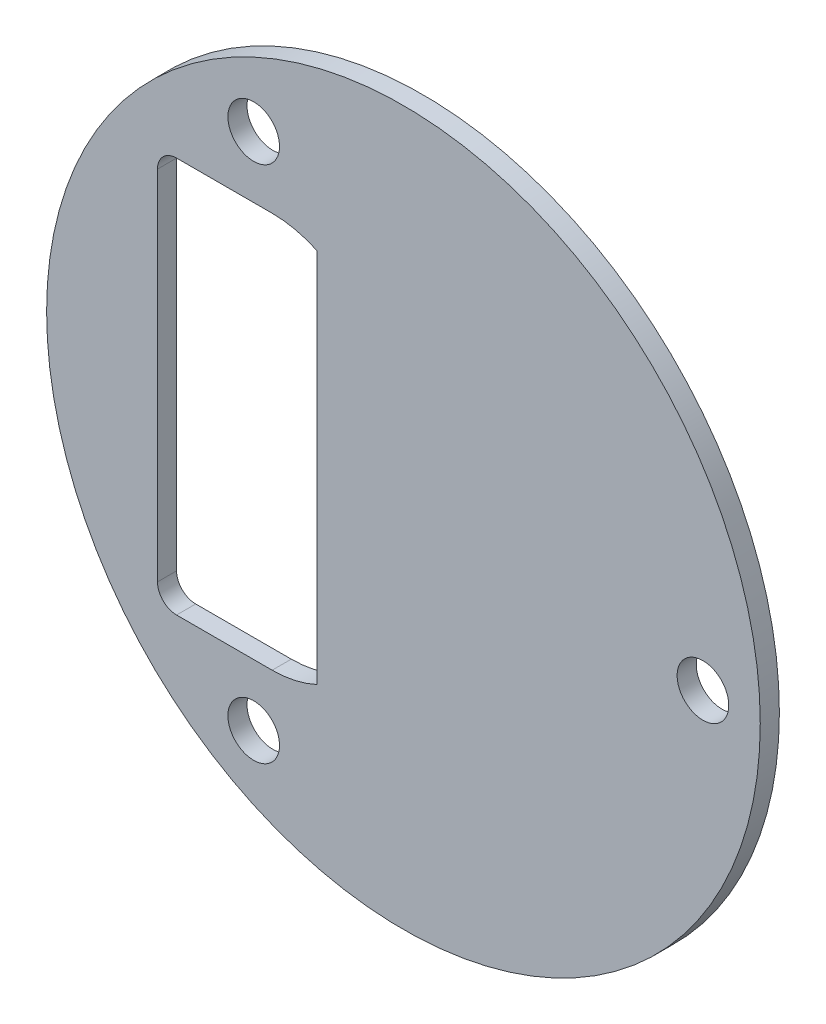
ISO-10303-21;
HEADER;
FILE_DESCRIPTION(('STEP AP214'),'2;1');
FILE_NAME('part.step','',(''),(''),'','','');
FILE_SCHEMA(('AUTOMOTIVE_DESIGN { 1 0 10303 214 1 1 1 1 }'));
ENDSEC;
DATA;
#1=APPLICATION_CONTEXT('core data for automotive mechanical design processes');
#2=APPLICATION_PROTOCOL_DEFINITION('international standard','automotive_design',2000,#1);
#3=PRODUCT_CONTEXT('',#1,'mechanical');
#4=PRODUCT('Part','Part','',(#3));
#5=PRODUCT_RELATED_PRODUCT_CATEGORY('part','',(#4));
#6=PRODUCT_DEFINITION_FORMATION('','',#4);
#7=PRODUCT_DEFINITION_CONTEXT('part definition',#1,'design');
#8=PRODUCT_DEFINITION('design','',#6,#7);
#9=PRODUCT_DEFINITION_SHAPE('','',#8);
#10=(LENGTH_UNIT() NAMED_UNIT(*) SI_UNIT(.MILLI.,.METRE.));
#11=(NAMED_UNIT(*) PLANE_ANGLE_UNIT() SI_UNIT($,.RADIAN.));
#12=(NAMED_UNIT(*) SI_UNIT($,.STERADIAN.) SOLID_ANGLE_UNIT());
#13=UNCERTAINTY_MEASURE_WITH_UNIT(LENGTH_MEASURE(1.E-05),#10,'distance_accuracy_value','');
#14=(GEOMETRIC_REPRESENTATION_CONTEXT(3) GLOBAL_UNCERTAINTY_ASSIGNED_CONTEXT((#13)) GLOBAL_UNIT_ASSIGNED_CONTEXT((#10,
#11,#12)) REPRESENTATION_CONTEXT('',''));
#15=CARTESIAN_POINT('',(0.,0.,0.));
#16=DIRECTION('',(0.,0.,1.));
#17=DIRECTION('',(1.,0.,0.));
#18=AXIS2_PLACEMENT_3D('',#15,#16,#17);
#19=CARTESIAN_POINT('',(0.,31.05,3.));
#20=DIRECTION('',(0.,-1.,0.));
#21=DIRECTION('',(1.,0.,0.));
#22=AXIS2_PLACEMENT_3D('',#19,#20,#21);
#23=PLANE('',#22);
#24=DIRECTION('',(-1.,0.,0.));
#25=VECTOR('',#24,1.);
#26=CARTESIAN_POINT('',(0.,31.05,0.));
#27=LINE('',#26,#25);
#28=CARTESIAN_POINT('',(-20.6036211039443,31.05,0.));
#29=VERTEX_POINT('',#28);
#30=CARTESIAN_POINT('',(-35.6036211039443,31.05,0.));
#31=VERTEX_POINT('',#30);
#32=EDGE_CURVE('E176',#29,#31,#27,.T.);
#33=ORIENTED_EDGE('',*,*,#32,.F.);
#34=DIRECTION('',(0.,0.,-1.));
#35=VECTOR('',#34,1.);
#36=CARTESIAN_POINT('',(-20.6036211039443,31.05,3.));
#37=LINE('',#36,#35);
#38=CARTESIAN_POINT('',(-20.6036211039443,31.05,3.));
#39=VERTEX_POINT('',#38);
#40=EDGE_CURVE('E11',#39,#29,#37,.T.);
#41=ORIENTED_EDGE('',*,*,#40,.F.);
#42=DIRECTION('',(-1.,0.,0.));
#43=VECTOR('',#42,1.);
#44=CARTESIAN_POINT('',(0.,31.05,3.));
#45=LINE('',#44,#43);
#46=CARTESIAN_POINT('',(-35.6036211039443,31.05,3.));
#47=VERTEX_POINT('',#46);
#48=EDGE_CURVE('E389',#39,#47,#45,.T.);
#49=ORIENTED_EDGE('',*,*,#48,.T.);
#50=DIRECTION('',(0.,0.,-1.));
#51=VECTOR('',#50,1.);
#52=CARTESIAN_POINT('',(-35.6036211039443,31.05,3.));
#53=LINE('',#52,#51);
#54=EDGE_CURVE('E66',#47,#31,#53,.T.);
#55=ORIENTED_EDGE('',*,*,#54,.T.);
#56=EDGE_LOOP('',(#33,#41,#49,#55));
#57=FACE_BOUND('',#56,.T.);
#58=ADVANCED_FACE('F45',(#57),#23,.T.);
#59=CARTESIAN_POINT('',(-20.6036211039443,14.4685483870968,3.));
#60=DIRECTION('',(0.,0.,-1.));
#61=DIRECTION('',(-1.,0.,0.));
#62=AXIS2_PLACEMENT_3D('',#59,#60,#61);
#63=CYLINDRICAL_SURFACE('',#62,16.5814516129032);
#64=CARTESIAN_POINT('',(-20.6036211039443,14.4685483870968,0.));
#65=DIRECTION('',(0.,0.,1.));
#66=DIRECTION('',(1.,0.,0.));
#67=AXIS2_PLACEMENT_3D('',#64,#65,#66);
#68=CIRCLE('',#67,16.5814516129032);
#69=CARTESIAN_POINT('',(-13.6036211039443,29.5,0.));
#70=VERTEX_POINT('',#69);
#71=EDGE_CURVE('E179',#29,#70,#68,.F.);
#72=ORIENTED_EDGE('',*,*,#71,.T.);
#73=DIRECTION('',(0.,0.,-1.));
#74=VECTOR('',#73,1.);
#75=CARTESIAN_POINT('',(-13.6036211039443,29.5,3.));
#76=LINE('',#75,#74);
#77=CARTESIAN_POINT('',(-13.6036211039443,29.5,3.));
#78=VERTEX_POINT('',#77);
#79=EDGE_CURVE('E55',#78,#70,#76,.T.);
#80=ORIENTED_EDGE('',*,*,#79,.F.);
#81=CARTESIAN_POINT('',(-20.6036211039443,14.4685483870968,3.));
#82=DIRECTION('',(0.,0.,1.));
#83=DIRECTION('',(1.,0.,0.));
#84=AXIS2_PLACEMENT_3D('',#81,#82,#83);
#85=CIRCLE('',#84,16.5814516129032);
#86=EDGE_CURVE('E386',#39,#78,#85,.F.);
#87=ORIENTED_EDGE('',*,*,#86,.F.);
#88=ORIENTED_EDGE('',*,*,#40,.T.);
#89=EDGE_LOOP('',(#72,#80,#87,#88));
#90=FACE_BOUND('',#89,.T.);
#91=ADVANCED_FACE('F227',(#90),#63,.F.);
#92=CARTESIAN_POINT('',(-13.6036211039443,0.,3.));
#93=DIRECTION('',(1.,0.,0.));
#94=DIRECTION('',(0.,0.,-1.));
#95=AXIS2_PLACEMENT_3D('',#92,#93,#94);
#96=PLANE('',#95);
#97=DIRECTION('',(0.,-1.,0.));
#98=VECTOR('',#97,1.);
#99=CARTESIAN_POINT('',(-13.6036211039443,0.,0.));
#100=LINE('',#99,#98);
#101=CARTESIAN_POINT('',(-13.6036211039443,-29.5,0.));
#102=VERTEX_POINT('',#101);
#103=EDGE_CURVE('E183',#70,#102,#100,.T.);
#104=ORIENTED_EDGE('',*,*,#103,.T.);
#105=DIRECTION('',(0.,0.,-1.));
#106=VECTOR('',#105,1.);
#107=CARTESIAN_POINT('',(-13.6036211039443,-29.5,3.));
#108=LINE('',#107,#106);
#109=CARTESIAN_POINT('',(-13.6036211039443,-29.5,3.));
#110=VERTEX_POINT('',#109);
#111=EDGE_CURVE('E214',#110,#102,#108,.T.);
#112=ORIENTED_EDGE('',*,*,#111,.F.);
#113=DIRECTION('',(0.,-1.,0.));
#114=VECTOR('',#113,1.);
#115=CARTESIAN_POINT('',(-13.6036211039443,0.,3.));
#116=LINE('',#115,#114);
#117=EDGE_CURVE('E223',#78,#110,#116,.T.);
#118=ORIENTED_EDGE('',*,*,#117,.F.);
#119=ORIENTED_EDGE('',*,*,#79,.T.);
#120=EDGE_LOOP('',(#104,#112,#118,#119));
#121=FACE_BOUND('',#120,.T.);
#122=ADVANCED_FACE('F221',(#121),#96,.F.);
#123=CARTESIAN_POINT('',(-20.6036211039443,-14.4685483870968,3.));
#124=DIRECTION('',(0.,0.,-1.));
#125=DIRECTION('',(-1.,0.,0.));
#126=AXIS2_PLACEMENT_3D('',#123,#124,#125);
#127=CYLINDRICAL_SURFACE('',#126,16.5814516129032);
#128=CARTESIAN_POINT('',(-20.6036211039443,-14.4685483870968,0.));
#129=DIRECTION('',(0.,0.,1.));
#130=DIRECTION('',(1.,0.,0.));
#131=AXIS2_PLACEMENT_3D('',#128,#129,#130);
#132=CIRCLE('',#131,16.5814516129032);
#133=CARTESIAN_POINT('',(-20.6036211039443,-31.05,0.));
#134=VERTEX_POINT('',#133);
#135=EDGE_CURVE('E187',#134,#102,#132,.T.);
#136=ORIENTED_EDGE('',*,*,#135,.F.);
#137=DIRECTION('',(0.,0.,-1.));
#138=VECTOR('',#137,1.);
#139=CARTESIAN_POINT('',(-20.6036211039443,-31.05,3.));
#140=LINE('',#139,#138);
#141=CARTESIAN_POINT('',(-20.6036211039443,-31.05,3.));
#142=VERTEX_POINT('',#141);
#143=EDGE_CURVE('E211',#142,#134,#140,.T.);
#144=ORIENTED_EDGE('',*,*,#143,.F.);
#145=CARTESIAN_POINT('',(-20.6036211039443,-14.4685483870968,3.));
#146=DIRECTION('',(0.,0.,1.));
#147=DIRECTION('',(1.,0.,0.));
#148=AXIS2_PLACEMENT_3D('',#145,#146,#147);
#149=CIRCLE('',#148,16.5814516129032);
#150=EDGE_CURVE('E381',#142,#110,#149,.T.);
#151=ORIENTED_EDGE('',*,*,#150,.T.);
#152=ORIENTED_EDGE('',*,*,#111,.T.);
#153=EDGE_LOOP('',(#136,#144,#151,#152));
#154=FACE_BOUND('',#153,.T.);
#155=ADVANCED_FACE('F283',(#154),#127,.F.);
#156=CARTESIAN_POINT('',(0.,-31.05,3.));
#157=DIRECTION('',(0.,1.,0.));
#158=DIRECTION('',(-1.,0.,0.));
#159=AXIS2_PLACEMENT_3D('',#156,#157,#158);
#160=PLANE('',#159);
#161=DIRECTION('',(1.,0.,0.));
#162=VECTOR('',#161,1.);
#163=CARTESIAN_POINT('',(0.,-31.05,0.));
#164=LINE('',#163,#162);
#165=CARTESIAN_POINT('',(-35.6036211039443,-31.05,0.));
#166=VERTEX_POINT('',#165);
#167=EDGE_CURVE('E191',#166,#134,#164,.T.);
#168=ORIENTED_EDGE('',*,*,#167,.F.);
#169=DIRECTION('',(0.,0.,-1.));
#170=VECTOR('',#169,1.);
#171=CARTESIAN_POINT('',(-35.6036211039443,-31.05,3.));
#172=LINE('',#171,#170);
#173=CARTESIAN_POINT('',(-35.6036211039443,-31.05,3.));
#174=VERTEX_POINT('',#173);
#175=EDGE_CURVE('E139',#174,#166,#172,.T.);
#176=ORIENTED_EDGE('',*,*,#175,.F.);
#177=DIRECTION('',(1.,0.,0.));
#178=VECTOR('',#177,1.);
#179=CARTESIAN_POINT('',(0.,-31.05,3.));
#180=LINE('',#179,#178);
#181=EDGE_CURVE('E150',#174,#142,#180,.T.);
#182=ORIENTED_EDGE('',*,*,#181,.T.);
#183=ORIENTED_EDGE('',*,*,#143,.T.);
#184=EDGE_LOOP('',(#168,#176,#182,#183));
#185=FACE_BOUND('',#184,.T.);
#186=ADVANCED_FACE('F280',(#185),#160,.T.);
#187=CARTESIAN_POINT('',(-35.6036211039443,-28.05,3.));
#188=DIRECTION('',(0.,0.,-1.));
#189=DIRECTION('',(-1.,0.,0.));
#190=AXIS2_PLACEMENT_3D('',#187,#188,#189);
#191=CYLINDRICAL_SURFACE('',#190,3.);
#192=CARTESIAN_POINT('',(-35.6036211039443,-28.05,0.));
#193=DIRECTION('',(0.,0.,1.));
#194=DIRECTION('',(1.,0.,0.));
#195=AXIS2_PLACEMENT_3D('',#192,#193,#194);
#196=CIRCLE('',#195,3.);
#197=CARTESIAN_POINT('',(-38.6036211039443,-28.05,0.));
#198=VERTEX_POINT('',#197);
#199=EDGE_CURVE('E134',#198,#166,#196,.T.);
#200=ORIENTED_EDGE('',*,*,#199,.F.);
#201=DIRECTION('',(0.,0.,-1.));
#202=VECTOR('',#201,1.);
#203=CARTESIAN_POINT('',(-38.6036211039443,-28.05,3.));
#204=LINE('',#203,#202);
#205=CARTESIAN_POINT('',(-38.6036211039443,-28.05,3.));
#206=VERTEX_POINT('',#205);
#207=EDGE_CURVE('E129',#206,#198,#204,.T.);
#208=ORIENTED_EDGE('',*,*,#207,.F.);
#209=CARTESIAN_POINT('',(-35.6036211039443,-28.05,3.));
#210=DIRECTION('',(0.,0.,1.));
#211=DIRECTION('',(1.,0.,0.));
#212=AXIS2_PLACEMENT_3D('',#209,#210,#211);
#213=CIRCLE('',#212,3.);
#214=EDGE_CURVE('E132',#206,#174,#213,.T.);
#215=ORIENTED_EDGE('',*,*,#214,.T.);
#216=ORIENTED_EDGE('',*,*,#175,.T.);
#217=EDGE_LOOP('',(#200,#208,#215,#216));
#218=FACE_BOUND('',#217,.T.);
#219=ADVANCED_FACE('F131',(#218),#191,.F.);
#220=CARTESIAN_POINT('',(-38.6036211039443,0.,3.));
#221=DIRECTION('',(1.,0.,0.));
#222=DIRECTION('',(0.,1.,0.));
#223=AXIS2_PLACEMENT_3D('',#220,#221,#222);
#224=PLANE('',#223);
#225=DIRECTION('',(0.,-1.,0.));
#226=VECTOR('',#225,1.);
#227=CARTESIAN_POINT('',(-38.6036211039443,0.,0.));
#228=LINE('',#227,#226);
#229=CARTESIAN_POINT('',(-38.6036211039443,28.05,0.));
#230=VERTEX_POINT('',#229);
#231=EDGE_CURVE('E197',#230,#198,#228,.T.);
#232=ORIENTED_EDGE('',*,*,#231,.F.);
#233=DIRECTION('',(0.,0.,-1.));
#234=VECTOR('',#233,1.);
#235=CARTESIAN_POINT('',(-38.6036211039443,28.05,3.));
#236=LINE('',#235,#234);
#237=CARTESIAN_POINT('',(-38.6036211039443,28.05,3.));
#238=VERTEX_POINT('',#237);
#239=EDGE_CURVE('E100',#238,#230,#236,.T.);
#240=ORIENTED_EDGE('',*,*,#239,.F.);
#241=DIRECTION('',(0.,-1.,0.));
#242=VECTOR('',#241,1.);
#243=CARTESIAN_POINT('',(-38.6036211039443,0.,3.));
#244=LINE('',#243,#242);
#245=EDGE_CURVE('E147',#238,#206,#244,.T.);
#246=ORIENTED_EDGE('',*,*,#245,.T.);
#247=ORIENTED_EDGE('',*,*,#207,.T.);
#248=EDGE_LOOP('',(#232,#240,#246,#247));
#249=FACE_BOUND('',#248,.T.);
#250=ADVANCED_FACE('F153',(#249),#224,.T.);
#251=CARTESIAN_POINT('',(0.,0.,3.));
#252=DIRECTION('',(0.,0.,-1.));
#253=DIRECTION('',(-1.,0.,0.));
#254=AXIS2_PLACEMENT_3D('',#251,#252,#253);
#255=CYLINDRICAL_SURFACE('',#254,56.);
#256=CARTESIAN_POINT('',(0.,0.,3.));
#257=DIRECTION('',(0.,0.,1.));
#258=DIRECTION('',(1.,0.,0.));
#259=AXIS2_PLACEMENT_3D('',#256,#257,#258);
#260=CIRCLE('',#259,56.);
#261=CARTESIAN_POINT('',(56.,0.,3.));
#262=VERTEX_POINT('',#261);
#263=EDGE_CURVE('E392',#262,#262,#260,.T.);
#264=ORIENTED_EDGE('',*,*,#263,.F.);
#265=EDGE_LOOP('',(#264));
#266=FACE_BOUND('',#265,.T.);
#267=CARTESIAN_POINT('',(0.,0.,0.));
#268=DIRECTION('',(0.,0.,1.));
#269=DIRECTION('',(1.,0.,0.));
#270=AXIS2_PLACEMENT_3D('',#267,#268,#269);
#271=CIRCLE('',#270,56.);
#272=CARTESIAN_POINT('',(56.,0.,0.));
#273=VERTEX_POINT('',#272);
#274=EDGE_CURVE('E172',#273,#273,#271,.T.);
#275=ORIENTED_EDGE('',*,*,#274,.T.);
#276=EDGE_LOOP('',(#275));
#277=FACE_BOUND('',#276,.T.);
#278=ADVANCED_FACE('F238',(#266,#277),#255,.T.);
#279=CARTESIAN_POINT('',(47.,0.,3.));
#280=DIRECTION('',(0.,0.,-1.));
#281=DIRECTION('',(-1.,0.,0.));
#282=AXIS2_PLACEMENT_3D('',#279,#280,#281);
#283=CYLINDRICAL_SURFACE('',#282,4.05);
#284=CARTESIAN_POINT('',(47.,0.,3.));
#285=DIRECTION('',(0.,0.,1.));
#286=DIRECTION('',(1.,0.,0.));
#287=AXIS2_PLACEMENT_3D('',#284,#285,#286);
#288=CIRCLE('',#287,4.05);
#289=CARTESIAN_POINT('',(51.05,0.,3.));
#290=VERTEX_POINT('',#289);
#291=EDGE_CURVE('E396',#290,#290,#288,.T.);
#292=ORIENTED_EDGE('',*,*,#291,.T.);
#293=EDGE_LOOP('',(#292));
#294=FACE_BOUND('',#293,.T.);
#295=CARTESIAN_POINT('',(47.,0.,0.));
#296=DIRECTION('',(0.,0.,1.));
#297=DIRECTION('',(1.,0.,0.));
#298=AXIS2_PLACEMENT_3D('',#295,#296,#297);
#299=CIRCLE('',#298,4.05);
#300=CARTESIAN_POINT('',(51.05,0.,0.));
#301=VERTEX_POINT('',#300);
#302=EDGE_CURVE('E169',#301,#301,#299,.T.);
#303=ORIENTED_EDGE('',*,*,#302,.F.);
#304=EDGE_LOOP('',(#303));
#305=FACE_BOUND('',#304,.T.);
#306=ADVANCED_FACE('F241',(#294,#305),#283,.F.);
#307=CARTESIAN_POINT('',(-23.5,-40.7031939778686,3.));
#308=DIRECTION('',(0.,0.,-1.));
#309=DIRECTION('',(-1.,0.,0.));
#310=AXIS2_PLACEMENT_3D('',#307,#308,#309);
#311=CYLINDRICAL_SURFACE('',#310,4.05);
#312=CARTESIAN_POINT('',(-23.5,-40.7031939778686,3.));
#313=DIRECTION('',(0.,0.,1.));
#314=DIRECTION('',(1.,0.,0.));
#315=AXIS2_PLACEMENT_3D('',#312,#313,#314);
#316=CIRCLE('',#315,4.05);
#317=CARTESIAN_POINT('',(-19.45,-40.7031939778686,3.));
#318=VERTEX_POINT('',#317);
#319=EDGE_CURVE('E256',#318,#318,#316,.T.);
#320=ORIENTED_EDGE('',*,*,#319,.T.);
#321=EDGE_LOOP('',(#320));
#322=FACE_BOUND('',#321,.T.);
#323=CARTESIAN_POINT('',(-23.5,-40.7031939778686,0.));
#324=DIRECTION('',(0.,0.,1.));
#325=DIRECTION('',(1.,0.,0.));
#326=AXIS2_PLACEMENT_3D('',#323,#324,#325);
#327=CIRCLE('',#326,4.05);
#328=CARTESIAN_POINT('',(-19.45,-40.7031939778686,0.));
#329=VERTEX_POINT('',#328);
#330=EDGE_CURVE('E165',#329,#329,#327,.T.);
#331=ORIENTED_EDGE('',*,*,#330,.F.);
#332=EDGE_LOOP('',(#331));
#333=FACE_BOUND('',#332,.T.);
#334=ADVANCED_FACE('F244',(#322,#333),#311,.F.);
#335=CARTESIAN_POINT('',(-23.5,40.7031939778686,3.));
#336=DIRECTION('',(0.,0.,-1.));
#337=DIRECTION('',(-1.,0.,0.));
#338=AXIS2_PLACEMENT_3D('',#335,#336,#337);
#339=CYLINDRICAL_SURFACE('',#338,4.04999999999999);
#340=CARTESIAN_POINT('',(-23.5,40.7031939778686,3.));
#341=DIRECTION('',(0.,0.,1.));
#342=DIRECTION('',(1.,0.,0.));
#343=AXIS2_PLACEMENT_3D('',#340,#341,#342);
#344=CIRCLE('',#343,4.04999999999999);
#345=CARTESIAN_POINT('',(-19.45,40.7031939778686,3.));
#346=VERTEX_POINT('',#345);
#347=EDGE_CURVE('E204',#346,#346,#344,.T.);
#348=ORIENTED_EDGE('',*,*,#347,.T.);
#349=EDGE_LOOP('',(#348));
#350=FACE_BOUND('',#349,.T.);
#351=CARTESIAN_POINT('',(-23.5,40.7031939778686,0.));
#352=DIRECTION('',(0.,0.,1.));
#353=DIRECTION('',(1.,0.,0.));
#354=AXIS2_PLACEMENT_3D('',#351,#352,#353);
#355=CIRCLE('',#354,4.04999999999999);
#356=CARTESIAN_POINT('',(-19.45,40.7031939778686,0.));
#357=VERTEX_POINT('',#356);
#358=EDGE_CURVE('E161',#357,#357,#355,.T.);
#359=ORIENTED_EDGE('',*,*,#358,.F.);
#360=EDGE_LOOP('',(#359));
#361=FACE_BOUND('',#360,.T.);
#362=ADVANCED_FACE('F47',(#350,#361),#339,.F.);
#363=CARTESIAN_POINT('',(-35.6036211039443,28.05,3.));
#364=DIRECTION('',(0.,0.,-1.));
#365=DIRECTION('',(-1.,0.,0.));
#366=AXIS2_PLACEMENT_3D('',#363,#364,#365);
#367=CYLINDRICAL_SURFACE('',#366,3.);
#368=CARTESIAN_POINT('',(-35.6036211039443,28.05,0.));
#369=DIRECTION('',(0.,0.,1.));
#370=DIRECTION('',(1.,0.,0.));
#371=AXIS2_PLACEMENT_3D('',#368,#369,#370);
#372=CIRCLE('',#371,3.);
#373=EDGE_CURVE('E200',#31,#230,#372,.T.);
#374=ORIENTED_EDGE('',*,*,#373,.F.);
#375=ORIENTED_EDGE('',*,*,#54,.F.);
#376=CARTESIAN_POINT('',(-35.6036211039443,28.05,3.));
#377=DIRECTION('',(0.,0.,1.));
#378=DIRECTION('',(1.,0.,0.));
#379=AXIS2_PLACEMENT_3D('',#376,#377,#378);
#380=CIRCLE('',#379,3.);
#381=EDGE_CURVE('E155',#47,#238,#380,.T.);
#382=ORIENTED_EDGE('',*,*,#381,.T.);
#383=ORIENTED_EDGE('',*,*,#239,.T.);
#384=EDGE_LOOP('',(#374,#375,#382,#383));
#385=FACE_BOUND('',#384,.T.);
#386=ADVANCED_FACE('F251',(#385),#367,.F.);
#387=CARTESIAN_POINT('',(0.,0.,3.));
#388=DIRECTION('',(0.,0.,1.));
#389=DIRECTION('',(1.,0.,0.));
#390=AXIS2_PLACEMENT_3D('',#387,#388,#389);
#391=PLANE('',#390);
#392=ORIENTED_EDGE('',*,*,#347,.F.);
#393=EDGE_LOOP('',(#392));
#394=FACE_BOUND('',#393,.T.);
#395=ORIENTED_EDGE('',*,*,#319,.F.);
#396=EDGE_LOOP('',(#395));
#397=FACE_BOUND('',#396,.T.);
#398=ORIENTED_EDGE('',*,*,#291,.F.);
#399=EDGE_LOOP('',(#398));
#400=FACE_BOUND('',#399,.T.);
#401=ORIENTED_EDGE('',*,*,#263,.T.);
#402=EDGE_LOOP('',(#401));
#403=FACE_BOUND('',#402,.T.);
#404=ORIENTED_EDGE('',*,*,#48,.F.);
#405=ORIENTED_EDGE('',*,*,#86,.T.);
#406=ORIENTED_EDGE('',*,*,#117,.T.);
#407=ORIENTED_EDGE('',*,*,#150,.F.);
#408=ORIENTED_EDGE('',*,*,#181,.F.);
#409=ORIENTED_EDGE('',*,*,#214,.F.);
#410=ORIENTED_EDGE('',*,*,#245,.F.);
#411=ORIENTED_EDGE('',*,*,#381,.F.);
#412=EDGE_LOOP('',(#404,#405,#406,#407,#408,#409,#410,#411));
#413=FACE_BOUND('',#412,.T.);
#414=ADVANCED_FACE('F145',(#394,#397,#400,#403,#413),#391,.T.);
#415=CARTESIAN_POINT('',(0.,0.,0.));
#416=DIRECTION('',(0.,0.,1.));
#417=DIRECTION('',(1.,0.,0.));
#418=AXIS2_PLACEMENT_3D('',#415,#416,#417);
#419=PLANE('',#418);
#420=ORIENTED_EDGE('',*,*,#358,.T.);
#421=EDGE_LOOP('',(#420));
#422=FACE_BOUND('',#421,.T.);
#423=ORIENTED_EDGE('',*,*,#330,.T.);
#424=EDGE_LOOP('',(#423));
#425=FACE_BOUND('',#424,.T.);
#426=ORIENTED_EDGE('',*,*,#302,.T.);
#427=EDGE_LOOP('',(#426));
#428=FACE_BOUND('',#427,.T.);
#429=ORIENTED_EDGE('',*,*,#274,.F.);
#430=EDGE_LOOP('',(#429));
#431=FACE_BOUND('',#430,.T.);
#432=ORIENTED_EDGE('',*,*,#32,.T.);
#433=ORIENTED_EDGE('',*,*,#373,.T.);
#434=ORIENTED_EDGE('',*,*,#231,.T.);
#435=ORIENTED_EDGE('',*,*,#199,.T.);
#436=ORIENTED_EDGE('',*,*,#167,.T.);
#437=ORIENTED_EDGE('',*,*,#135,.T.);
#438=ORIENTED_EDGE('',*,*,#103,.F.);
#439=ORIENTED_EDGE('',*,*,#71,.F.);
#440=EDGE_LOOP('',(#432,#433,#434,#435,#436,#437,#438,#439));
#441=FACE_BOUND('',#440,.T.);
#442=ADVANCED_FACE('F229',(#422,#425,#428,#431,#441),#419,.F.);
#443=CLOSED_SHELL('',(#58,#91,#122,#155,#186,#219,#250,#278,#306,#334,#362,#386,#414,#442));
#444=MANIFOLD_SOLID_BREP('B2',#443);
#445=ADVANCED_BREP_SHAPE_REPRESENTATION('',(#18,#444),#14);
#446=SHAPE_DEFINITION_REPRESENTATION(#9,#445);
ENDSEC;
END-ISO-10303-21;
